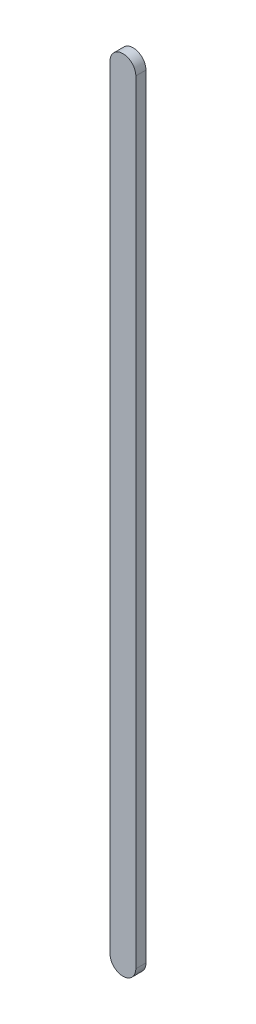
ISO-10303-21;
HEADER;
FILE_DESCRIPTION(('STEP AP214'),'2;1');
FILE_NAME('part.step','',(''),(''),'','','');
FILE_SCHEMA(('AUTOMOTIVE_DESIGN { 1 0 10303 214 1 1 1 1 }'));
ENDSEC;
DATA;
#1=APPLICATION_CONTEXT('core data for automotive mechanical design processes');
#2=APPLICATION_PROTOCOL_DEFINITION('international standard','automotive_design',2000,#1);
#3=PRODUCT_CONTEXT('',#1,'mechanical');
#4=PRODUCT('Part','Part','',(#3));
#5=PRODUCT_RELATED_PRODUCT_CATEGORY('part','',(#4));
#6=PRODUCT_DEFINITION_FORMATION('','',#4);
#7=PRODUCT_DEFINITION_CONTEXT('part definition',#1,'design');
#8=PRODUCT_DEFINITION('design','',#6,#7);
#9=PRODUCT_DEFINITION_SHAPE('','',#8);
#10=(LENGTH_UNIT() NAMED_UNIT(*) SI_UNIT(.MILLI.,.METRE.));
#11=(NAMED_UNIT(*) PLANE_ANGLE_UNIT() SI_UNIT($,.RADIAN.));
#12=(NAMED_UNIT(*) SI_UNIT($,.STERADIAN.) SOLID_ANGLE_UNIT());
#13=UNCERTAINTY_MEASURE_WITH_UNIT(LENGTH_MEASURE(1.E-05),#10,'distance_accuracy_value','');
#14=(GEOMETRIC_REPRESENTATION_CONTEXT(3) GLOBAL_UNCERTAINTY_ASSIGNED_CONTEXT((#13)) GLOBAL_UNIT_ASSIGNED_CONTEXT((#10,
#11,#12)) REPRESENTATION_CONTEXT('',''));
#15=CARTESIAN_POINT('',(0.,0.,0.));
#16=DIRECTION('',(0.,0.,1.));
#17=DIRECTION('',(1.,0.,0.));
#18=AXIS2_PLACEMENT_3D('',#15,#16,#17);
#19=CARTESIAN_POINT('',(156.718,102.87,0.));
#20=DIRECTION('',(-1.,0.,0.));
#21=DIRECTION('',(0.,1.,0.));
#22=AXIS2_PLACEMENT_3D('',#19,#20,#21);
#23=PLANE('',#22);
#24=DIRECTION('',(0.,1.,0.));
#25=VECTOR('',#24,1.);
#26=CARTESIAN_POINT('',(156.718,102.87,0.1999996));
#27=LINE('',#26,#25);
#28=CARTESIAN_POINT('',(156.718,102.87,0.1999996));
#29=VERTEX_POINT('',#28);
#30=CARTESIAN_POINT('',(156.718,118.11,0.1999996));
#31=VERTEX_POINT('',#30);
#32=EDGE_CURVE('E11',#29,#31,#27,.T.);
#33=ORIENTED_EDGE('',*,*,#32,.F.);
#34=DIRECTION('',(0.,0.,1.));
#35=VECTOR('',#34,1.);
#36=CARTESIAN_POINT('',(156.718,102.87,0.));
#37=LINE('',#36,#35);
#38=CARTESIAN_POINT('',(156.718,102.87,0.));
#39=VERTEX_POINT('',#38);
#40=EDGE_CURVE('E24',#39,#29,#37,.T.);
#41=ORIENTED_EDGE('',*,*,#40,.F.);
#42=DIRECTION('',(0.,1.,0.));
#43=VECTOR('',#42,1.);
#44=CARTESIAN_POINT('',(156.718,102.87,0.));
#45=LINE('',#44,#43);
#46=CARTESIAN_POINT('',(156.718,118.11,0.));
#47=VERTEX_POINT('',#46);
#48=EDGE_CURVE('E75',#39,#47,#45,.T.);
#49=ORIENTED_EDGE('',*,*,#48,.T.);
#50=DIRECTION('',(0.,0.,1.));
#51=VECTOR('',#50,1.);
#52=CARTESIAN_POINT('',(156.718,118.11,0.));
#53=LINE('',#52,#51);
#54=EDGE_CURVE('E37',#47,#31,#53,.T.);
#55=ORIENTED_EDGE('',*,*,#54,.T.);
#56=EDGE_LOOP('',(#33,#41,#49,#55));
#57=FACE_BOUND('',#56,.T.);
#58=ADVANCED_FACE('F17',(#57),#23,.F.);
#59=CARTESIAN_POINT('',(156.464,118.11,0.));
#60=DIRECTION('',(0.,0.,-1.));
#61=DIRECTION('',(1.,0.,0.));
#62=AXIS2_PLACEMENT_3D('',#59,#60,#61);
#63=CYLINDRICAL_SURFACE('',#62,0.254);
#64=CARTESIAN_POINT('',(156.464,118.11,0.1999996));
#65=DIRECTION('',(0.,0.,1.));
#66=DIRECTION('',(1.,0.,0.));
#67=AXIS2_PLACEMENT_3D('',#64,#65,#66);
#68=CIRCLE('',#67,0.254);
#69=CARTESIAN_POINT('',(156.21,118.11,0.1999996));
#70=VERTEX_POINT('',#69);
#71=EDGE_CURVE('E83',#31,#70,#68,.T.);
#72=ORIENTED_EDGE('',*,*,#71,.F.);
#73=ORIENTED_EDGE('',*,*,#54,.F.);
#74=CARTESIAN_POINT('',(156.464,118.11,0.));
#75=DIRECTION('',(0.,0.,1.));
#76=DIRECTION('',(1.,0.,0.));
#77=AXIS2_PLACEMENT_3D('',#74,#75,#76);
#78=CIRCLE('',#77,0.254);
#79=CARTESIAN_POINT('',(156.21,118.11,0.));
#80=VERTEX_POINT('',#79);
#81=EDGE_CURVE('E81',#47,#80,#78,.T.);
#82=ORIENTED_EDGE('',*,*,#81,.T.);
#83=DIRECTION('',(0.,0.,1.));
#84=VECTOR('',#83,1.);
#85=CARTESIAN_POINT('',(156.21,118.11,0.));
#86=LINE('',#85,#84);
#87=EDGE_CURVE('E67',#80,#70,#86,.T.);
#88=ORIENTED_EDGE('',*,*,#87,.T.);
#89=EDGE_LOOP('',(#72,#73,#82,#88));
#90=FACE_BOUND('',#89,.T.);
#91=ADVANCED_FACE('F89',(#90),#63,.T.);
#92=CARTESIAN_POINT('',(156.21,118.11,0.));
#93=DIRECTION('',(1.,0.,0.));
#94=DIRECTION('',(0.,-1.,0.));
#95=AXIS2_PLACEMENT_3D('',#92,#93,#94);
#96=PLANE('',#95);
#97=DIRECTION('',(0.,-1.,0.));
#98=VECTOR('',#97,1.);
#99=CARTESIAN_POINT('',(156.21,118.11,0.1999996));
#100=LINE('',#99,#98);
#101=CARTESIAN_POINT('',(156.21,102.87,0.1999996));
#102=VERTEX_POINT('',#101);
#103=EDGE_CURVE('E71',#70,#102,#100,.T.);
#104=ORIENTED_EDGE('',*,*,#103,.F.);
#105=ORIENTED_EDGE('',*,*,#87,.F.);
#106=DIRECTION('',(0.,-1.,0.));
#107=VECTOR('',#106,1.);
#108=CARTESIAN_POINT('',(156.21,118.11,0.));
#109=LINE('',#108,#107);
#110=CARTESIAN_POINT('',(156.21,102.87,0.));
#111=VERTEX_POINT('',#110);
#112=EDGE_CURVE('E63',#80,#111,#109,.T.);
#113=ORIENTED_EDGE('',*,*,#112,.T.);
#114=DIRECTION('',(0.,0.,1.));
#115=VECTOR('',#114,1.);
#116=CARTESIAN_POINT('',(156.21,102.87,0.));
#117=LINE('',#116,#115);
#118=EDGE_CURVE('E53',#111,#102,#117,.T.);
#119=ORIENTED_EDGE('',*,*,#118,.T.);
#120=EDGE_LOOP('',(#104,#105,#113,#119));
#121=FACE_BOUND('',#120,.T.);
#122=ADVANCED_FACE('F66',(#121),#96,.F.);
#123=CARTESIAN_POINT('',(156.464,102.87,0.));
#124=DIRECTION('',(0.,0.,-1.));
#125=DIRECTION('',(-1.,0.,0.));
#126=AXIS2_PLACEMENT_3D('',#123,#124,#125);
#127=CYLINDRICAL_SURFACE('',#126,0.253999999999995);
#128=CARTESIAN_POINT('',(156.464,102.87,0.1999996));
#129=DIRECTION('',(0.,0.,1.));
#130=DIRECTION('',(-1.,0.,0.));
#131=AXIS2_PLACEMENT_3D('',#128,#129,#130);
#132=CIRCLE('',#131,0.253999999999995);
#133=EDGE_CURVE('E59',#102,#29,#132,.T.);
#134=ORIENTED_EDGE('',*,*,#133,.F.);
#135=ORIENTED_EDGE('',*,*,#118,.F.);
#136=CARTESIAN_POINT('',(156.464,102.87,0.));
#137=DIRECTION('',(0.,0.,1.));
#138=DIRECTION('',(-1.,0.,0.));
#139=AXIS2_PLACEMENT_3D('',#136,#137,#138);
#140=CIRCLE('',#139,0.253999999999995);
#141=EDGE_CURVE('E57',#111,#39,#140,.T.);
#142=ORIENTED_EDGE('',*,*,#141,.T.);
#143=ORIENTED_EDGE('',*,*,#40,.T.);
#144=EDGE_LOOP('',(#134,#135,#142,#143));
#145=FACE_BOUND('',#144,.T.);
#146=ADVANCED_FACE('F55',(#145),#127,.T.);
#147=CARTESIAN_POINT('',(156.718,102.87,0.));
#148=DIRECTION('',(0.,0.,-1.));
#149=DIRECTION('',(-1.,0.,0.));
#150=AXIS2_PLACEMENT_3D('',#147,#148,#149);
#151=PLANE('',#150);
#152=ORIENTED_EDGE('',*,*,#141,.F.);
#153=ORIENTED_EDGE('',*,*,#112,.F.);
#154=ORIENTED_EDGE('',*,*,#81,.F.);
#155=ORIENTED_EDGE('',*,*,#48,.F.);
#156=EDGE_LOOP('',(#152,#153,#154,#155));
#157=FACE_BOUND('',#156,.T.);
#158=ADVANCED_FACE('F74',(#157),#151,.T.);
#159=CARTESIAN_POINT('',(156.718,102.87,0.1999996));
#160=DIRECTION('',(0.,0.,-1.));
#161=DIRECTION('',(-1.,0.,0.));
#162=AXIS2_PLACEMENT_3D('',#159,#160,#161);
#163=PLANE('',#162);
#164=ORIENTED_EDGE('',*,*,#32,.T.);
#165=ORIENTED_EDGE('',*,*,#71,.T.);
#166=ORIENTED_EDGE('',*,*,#103,.T.);
#167=ORIENTED_EDGE('',*,*,#133,.T.);
#168=EDGE_LOOP('',(#164,#165,#166,#167));
#169=FACE_BOUND('',#168,.T.);
#170=ADVANCED_FACE('F91',(#169),#163,.F.);
#171=CLOSED_SHELL('',(#58,#91,#122,#146,#158,#170));
#172=MANIFOLD_SOLID_BREP('B1',#171);
#173=ADVANCED_BREP_SHAPE_REPRESENTATION('',(#18,#172),#14);
#174=SHAPE_DEFINITION_REPRESENTATION(#9,#173);
ENDSEC;
END-ISO-10303-21;
